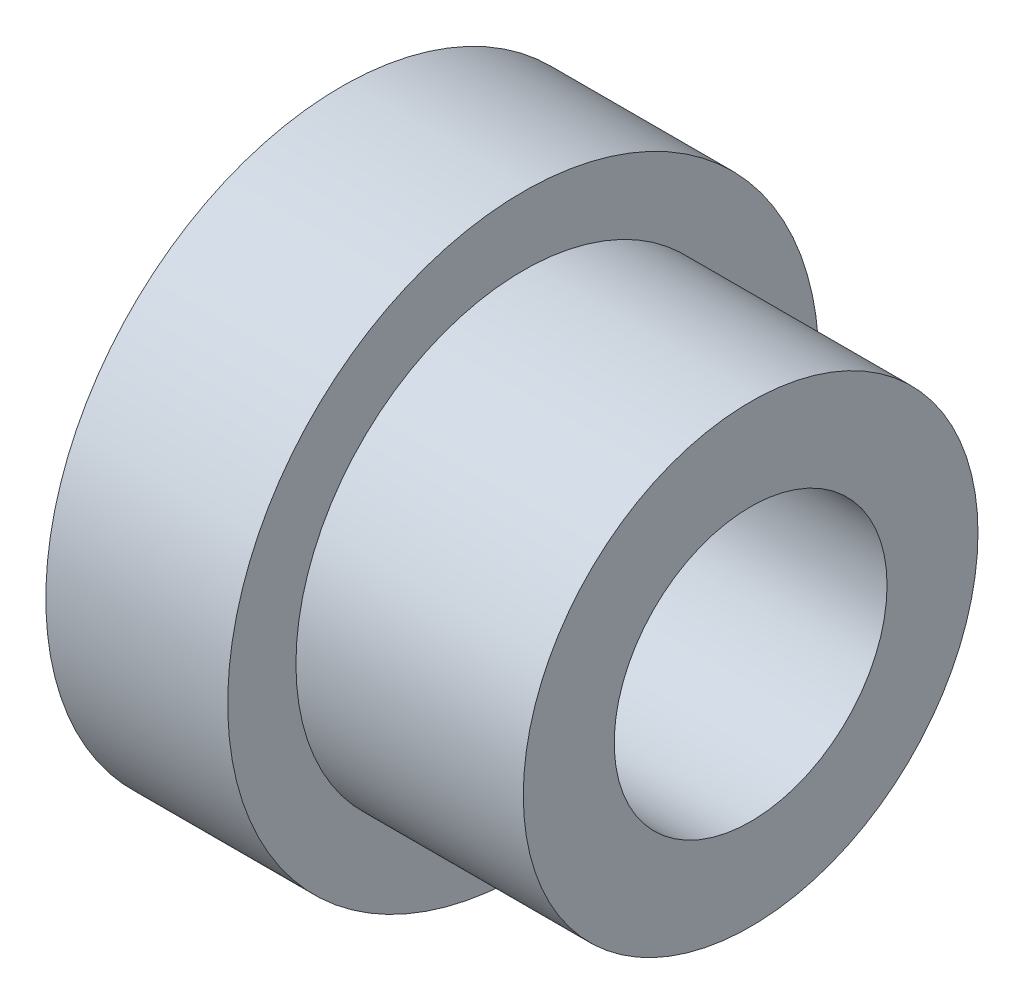
ISO-10303-21;
HEADER;
FILE_DESCRIPTION(('STEP AP214'),'2;1');
FILE_NAME('part.step','',(''),(''),'','','');
FILE_SCHEMA(('AUTOMOTIVE_DESIGN { 1 0 10303 214 1 1 1 1 }'));
ENDSEC;
DATA;
#1=APPLICATION_CONTEXT('core data for automotive mechanical design processes');
#2=APPLICATION_PROTOCOL_DEFINITION('international standard','automotive_design',2000,#1);
#3=PRODUCT_CONTEXT('',#1,'mechanical');
#4=PRODUCT('Part','Part','',(#3));
#5=PRODUCT_RELATED_PRODUCT_CATEGORY('part','',(#4));
#6=PRODUCT_DEFINITION_FORMATION('','',#4);
#7=PRODUCT_DEFINITION_CONTEXT('part definition',#1,'design');
#8=PRODUCT_DEFINITION('design','',#6,#7);
#9=PRODUCT_DEFINITION_SHAPE('','',#8);
#10=(LENGTH_UNIT() NAMED_UNIT(*) SI_UNIT(.MILLI.,.METRE.));
#11=(NAMED_UNIT(*) PLANE_ANGLE_UNIT() SI_UNIT($,.RADIAN.));
#12=(NAMED_UNIT(*) SI_UNIT($,.STERADIAN.) SOLID_ANGLE_UNIT());
#13=UNCERTAINTY_MEASURE_WITH_UNIT(LENGTH_MEASURE(1.E-05),#10,'distance_accuracy_value','');
#14=(GEOMETRIC_REPRESENTATION_CONTEXT(3) GLOBAL_UNCERTAINTY_ASSIGNED_CONTEXT((#13)) GLOBAL_UNIT_ASSIGNED_CONTEXT((#10,
#11,#12)) REPRESENTATION_CONTEXT('',''));
#15=CARTESIAN_POINT('',(0.,0.,0.));
#16=DIRECTION('',(0.,0.,1.));
#17=DIRECTION('',(1.,0.,0.));
#18=AXIS2_PLACEMENT_3D('',#15,#16,#17);
#19=CARTESIAN_POINT('',(28.575,0.,0.));
#20=DIRECTION('',(-1.,0.,0.));
#21=DIRECTION('',(0.,0.,1.));
#22=AXIS2_PLACEMENT_3D('',#19,#20,#21);
#23=CYLINDRICAL_SURFACE('',#22,9.525);
#24=CARTESIAN_POINT('',(28.575,0.,0.));
#25=DIRECTION('',(1.,0.,0.));
#26=DIRECTION('',(0.,0.,-1.));
#27=AXIS2_PLACEMENT_3D('',#24,#25,#26);
#28=CIRCLE('',#27,9.525);
#29=CARTESIAN_POINT('',(28.575,0.,-9.525));
#30=VERTEX_POINT('',#29);
#31=EDGE_CURVE('E40',#30,#30,#28,.T.);
#32=ORIENTED_EDGE('',*,*,#31,.T.);
#33=EDGE_LOOP('',(#32));
#34=FACE_BOUND('',#33,.T.);
#35=CARTESIAN_POINT('',(0.,0.,0.));
#36=DIRECTION('',(1.,0.,0.));
#37=DIRECTION('',(0.,0.,-1.));
#38=AXIS2_PLACEMENT_3D('',#35,#36,#37);
#39=CIRCLE('',#38,9.525);
#40=CARTESIAN_POINT('',(0.,0.,-9.525));
#41=VERTEX_POINT('',#40);
#42=EDGE_CURVE('E36',#41,#41,#39,.T.);
#43=ORIENTED_EDGE('',*,*,#42,.F.);
#44=EDGE_LOOP('',(#43));
#45=FACE_BOUND('',#44,.T.);
#46=ADVANCED_FACE('F33',(#34,#45),#23,.F.);
#47=CARTESIAN_POINT('',(28.575,0.,0.));
#48=DIRECTION('',(-1.,0.,0.));
#49=DIRECTION('',(0.,0.,1.));
#50=AXIS2_PLACEMENT_3D('',#47,#48,#49);
#51=CYLINDRICAL_SURFACE('',#50,15.875);
#52=CARTESIAN_POINT('',(12.7,0.,0.));
#53=DIRECTION('',(1.,0.,0.));
#54=DIRECTION('',(0.,0.,-1.));
#55=AXIS2_PLACEMENT_3D('',#52,#53,#54);
#56=CIRCLE('',#55,15.875);
#57=CARTESIAN_POINT('',(12.7,0.,-15.875));
#58=VERTEX_POINT('',#57);
#59=EDGE_CURVE('E49',#58,#58,#56,.T.);
#60=ORIENTED_EDGE('',*,*,#59,.T.);
#61=EDGE_LOOP('',(#60));
#62=FACE_BOUND('',#61,.T.);
#63=CARTESIAN_POINT('',(28.575,0.,0.));
#64=DIRECTION('',(1.,0.,0.));
#65=DIRECTION('',(0.,0.,-1.));
#66=AXIS2_PLACEMENT_3D('',#63,#64,#65);
#67=CIRCLE('',#66,15.875);
#68=CARTESIAN_POINT('',(28.575,0.,-15.875));
#69=VERTEX_POINT('',#68);
#70=EDGE_CURVE('E10',#69,#69,#67,.T.);
#71=ORIENTED_EDGE('',*,*,#70,.F.);
#72=EDGE_LOOP('',(#71));
#73=FACE_BOUND('',#72,.T.);
#74=ADVANCED_FACE('F56',(#62,#73),#51,.T.);
#75=CARTESIAN_POINT('',(28.575,0.,0.));
#76=DIRECTION('',(1.,0.,0.));
#77=DIRECTION('',(0.,0.,-1.));
#78=AXIS2_PLACEMENT_3D('',#75,#76,#77);
#79=PLANE('',#78);
#80=ORIENTED_EDGE('',*,*,#31,.F.);
#81=EDGE_LOOP('',(#80));
#82=FACE_BOUND('',#81,.T.);
#83=ORIENTED_EDGE('',*,*,#70,.T.);
#84=EDGE_LOOP('',(#83));
#85=FACE_BOUND('',#84,.T.);
#86=ADVANCED_FACE('F73',(#82,#85),#79,.T.);
#87=CARTESIAN_POINT('',(0.,0.,0.));
#88=DIRECTION('',(1.,0.,0.));
#89=DIRECTION('',(0.,0.,-1.));
#90=AXIS2_PLACEMENT_3D('',#87,#88,#89);
#91=PLANE('',#90);
#92=ORIENTED_EDGE('',*,*,#42,.T.);
#93=EDGE_LOOP('',(#92));
#94=FACE_BOUND('',#93,.T.);
#95=CARTESIAN_POINT('',(0.,0.,0.));
#96=DIRECTION('',(1.,0.,0.));
#97=DIRECTION('',(0.,0.,-1.));
#98=AXIS2_PLACEMENT_3D('',#95,#96,#97);
#99=CIRCLE('',#98,20.6375);
#100=CARTESIAN_POINT('',(0.,0.,-20.6375));
#101=VERTEX_POINT('',#100);
#102=EDGE_CURVE('E46',#101,#101,#99,.T.);
#103=ORIENTED_EDGE('',*,*,#102,.F.);
#104=EDGE_LOOP('',(#103));
#105=FACE_BOUND('',#104,.T.);
#106=ADVANCED_FACE('F68',(#94,#105),#91,.F.);
#107=CARTESIAN_POINT('',(12.7,0.,0.));
#108=DIRECTION('',(-1.,0.,0.));
#109=DIRECTION('',(0.,0.,1.));
#110=AXIS2_PLACEMENT_3D('',#107,#108,#109);
#111=CYLINDRICAL_SURFACE('',#110,20.6375);
#112=CARTESIAN_POINT('',(12.7,0.,0.));
#113=DIRECTION('',(1.,0.,0.));
#114=DIRECTION('',(0.,0.,-1.));
#115=AXIS2_PLACEMENT_3D('',#112,#113,#114);
#116=CIRCLE('',#115,20.6375);
#117=CARTESIAN_POINT('',(12.7,0.,-20.6375));
#118=VERTEX_POINT('',#117);
#119=EDGE_CURVE('E50',#118,#118,#116,.T.);
#120=ORIENTED_EDGE('',*,*,#119,.F.);
#121=EDGE_LOOP('',(#120));
#122=FACE_BOUND('',#121,.T.);
#123=ORIENTED_EDGE('',*,*,#102,.T.);
#124=EDGE_LOOP('',(#123));
#125=FACE_BOUND('',#124,.T.);
#126=ADVANCED_FACE('F62',(#122,#125),#111,.T.);
#127=CARTESIAN_POINT('',(12.7,0.,0.));
#128=DIRECTION('',(1.,0.,0.));
#129=DIRECTION('',(0.,0.,-1.));
#130=AXIS2_PLACEMENT_3D('',#127,#128,#129);
#131=PLANE('',#130);
#132=ORIENTED_EDGE('',*,*,#59,.F.);
#133=EDGE_LOOP('',(#132));
#134=FACE_BOUND('',#133,.T.);
#135=ORIENTED_EDGE('',*,*,#119,.T.);
#136=EDGE_LOOP('',(#135));
#137=FACE_BOUND('',#136,.T.);
#138=ADVANCED_FACE('F59',(#134,#137),#131,.T.);
#139=CLOSED_SHELL('',(#46,#74,#86,#106,#126,#138));
#140=MANIFOLD_SOLID_BREP('B2',#139);
#141=ADVANCED_BREP_SHAPE_REPRESENTATION('',(#18,#140),#14);
#142=SHAPE_DEFINITION_REPRESENTATION(#9,#141);
ENDSEC;
END-ISO-10303-21;
